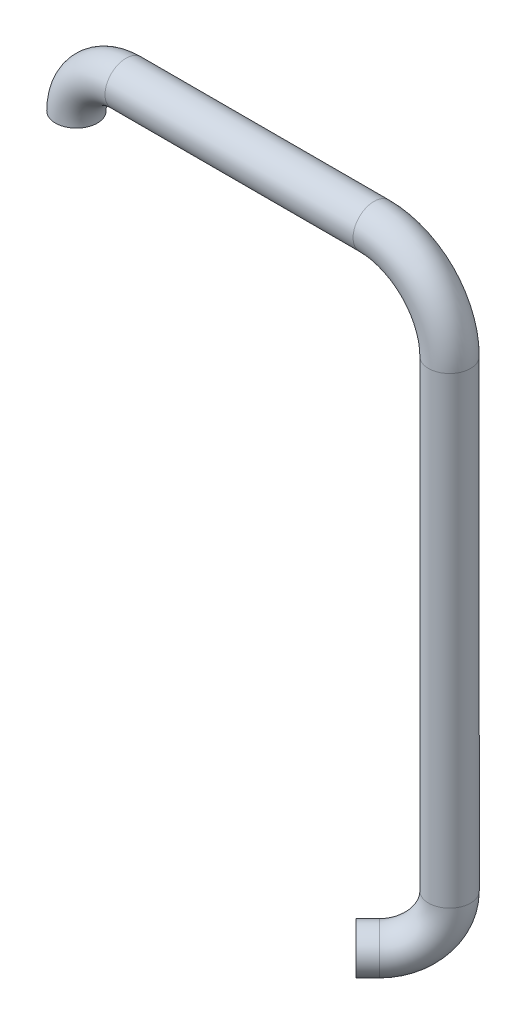
ISO-10303-21;
HEADER;
FILE_DESCRIPTION(('STEP AP214'),'2;1');
FILE_NAME('part.step','',(''),(''),'','','');
FILE_SCHEMA(('AUTOMOTIVE_DESIGN { 1 0 10303 214 1 1 1 1 }'));
ENDSEC;
DATA;
#1=APPLICATION_CONTEXT('core data for automotive mechanical design processes');
#2=APPLICATION_PROTOCOL_DEFINITION('international standard','automotive_design',2000,#1);
#3=PRODUCT_CONTEXT('',#1,'mechanical');
#4=PRODUCT('Part','Part','',(#3));
#5=PRODUCT_RELATED_PRODUCT_CATEGORY('part','',(#4));
#6=PRODUCT_DEFINITION_FORMATION('','',#4);
#7=PRODUCT_DEFINITION_CONTEXT('part definition',#1,'design');
#8=PRODUCT_DEFINITION('design','',#6,#7);
#9=PRODUCT_DEFINITION_SHAPE('','',#8);
#10=(LENGTH_UNIT() NAMED_UNIT(*) SI_UNIT(.MILLI.,.METRE.));
#11=(NAMED_UNIT(*) PLANE_ANGLE_UNIT() SI_UNIT($,.RADIAN.));
#12=(NAMED_UNIT(*) SI_UNIT($,.STERADIAN.) SOLID_ANGLE_UNIT());
#13=UNCERTAINTY_MEASURE_WITH_UNIT(LENGTH_MEASURE(1.E-05),#10,'distance_accuracy_value','');
#14=(GEOMETRIC_REPRESENTATION_CONTEXT(3) GLOBAL_UNCERTAINTY_ASSIGNED_CONTEXT((#13)) GLOBAL_UNIT_ASSIGNED_CONTEXT((#10,
#11,#12)) REPRESENTATION_CONTEXT('',''));
#15=CARTESIAN_POINT('',(0.,0.,0.));
#16=DIRECTION('',(0.,0.,1.));
#17=DIRECTION('',(1.,0.,0.));
#18=AXIS2_PLACEMENT_3D('',#15,#16,#17);
#19=CARTESIAN_POINT('',(175.213762880924,-340.00000000001,32.4817907597417));
#20=DIRECTION('',(-0.707106781186551,0.,0.707106781186544));
#21=DIRECTION('',(0.499999999999996,-0.707106781186551,0.5));
#22=AXIS2_PLACEMENT_3D('',#19,#20,#21);
#23=PLANE('',#22);
#24=CARTESIAN_POINT('',(175.213762880924,-340.00000000001,32.4817907597417));
#25=DIRECTION('',(-0.707106781186551,0.,0.707106781186544));
#26=DIRECTION('',(0.707106781186544,0.,0.707106781186551));
#27=AXIS2_PLACEMENT_3D('',#24,#25,#26);
#28=CIRCLE('',#27,9.7);
#29=CARTESIAN_POINT('',(182.072698658434,-340.00000000001,39.3407265372512));
#30=VERTEX_POINT('',#29);
#31=EDGE_CURVE('E91',#30,#30,#28,.T.);
#32=ORIENTED_EDGE('',*,*,#31,.F.);
#33=EDGE_LOOP('',(#32));
#34=FACE_BOUND('',#33,.T.);
#35=CARTESIAN_POINT('',(175.213762880924,-340.00000000001,32.4817907597417));
#36=DIRECTION('',(-0.707106781186551,0.,0.707106781186544));
#37=DIRECTION('',(0.499999999999996,-0.707106781186551,0.5));
#38=AXIS2_PLACEMENT_3D('',#35,#36,#37);
#39=CIRCLE('',#38,12.7);
#40=CARTESIAN_POINT('',(181.563762880924,-348.980256121079,38.8317907597417));
#41=VERTEX_POINT('',#40);
#42=EDGE_CURVE('E82',#41,#41,#39,.T.);
#43=ORIENTED_EDGE('',*,*,#42,.T.);
#44=EDGE_LOOP('',(#43));
#45=FACE_BOUND('',#44,.T.);
#46=ADVANCED_FACE('F51',(#34,#45),#23,.T.);
#47=CARTESIAN_POINT('',(-22.1673219572046,-14.3346439144093,4.19751951227996));
#48=DIRECTION('',(0.,1.,0.));
#49=DIRECTION('',(-1.,0.,0.));
#50=AXIS2_PLACEMENT_3D('',#47,#48,#49);
#51=PLANE('',#50);
#52=CARTESIAN_POINT('',(-22.1673219572046,-14.3346439144093,4.19751951227996));
#53=DIRECTION('',(0.,1.,0.));
#54=DIRECTION('',(-1.,0.,0.));
#55=AXIS2_PLACEMENT_3D('',#52,#53,#54);
#56=CIRCLE('',#55,9.7);
#57=CARTESIAN_POINT('',(-31.8673219572046,-14.3346439144093,4.19751951227996));
#58=VERTEX_POINT('',#57);
#59=EDGE_CURVE('E86',#58,#58,#56,.T.);
#60=ORIENTED_EDGE('',*,*,#59,.T.);
#61=EDGE_LOOP('',(#60));
#62=FACE_BOUND('',#61,.T.);
#63=CARTESIAN_POINT('',(-22.1673219572046,-14.3346439144093,4.19751951227996));
#64=DIRECTION('',(0.,1.,0.));
#65=DIRECTION('',(-1.,0.,0.));
#66=AXIS2_PLACEMENT_3D('',#63,#64,#65);
#67=CIRCLE('',#66,12.7);
#68=CARTESIAN_POINT('',(-34.8673219572046,-14.3346439144093,4.19751951227996));
#69=VERTEX_POINT('',#68);
#70=EDGE_CURVE('E11',#69,#69,#67,.T.);
#71=ORIENTED_EDGE('',*,*,#70,.F.);
#72=EDGE_LOOP('',(#71));
#73=FACE_BOUND('',#72,.T.);
#74=ADVANCED_FACE('F126',(#62,#73),#51,.F.);
#75=CARTESIAN_POINT('',(175.213762880924,-340.00000000001,32.4817907597417));
#76=DIRECTION('',(0.707106781186551,0.,-0.707106781186544));
#77=DIRECTION('',(-0.707106781186544,0.,-0.707106781186551));
#78=AXIS2_PLACEMENT_3D('',#75,#76,#77);
#79=CYLINDRICAL_SURFACE('',#78,12.7);
#80=CARTESIAN_POINT('',(182.28483069279,-340.00000000001,25.4107229478763));
#81=DIRECTION('',(-0.707106781186551,0.,0.707106781186544));
#82=DIRECTION('',(0.499999999999996,-0.707106781186551,0.5));
#83=AXIS2_PLACEMENT_3D('',#80,#81,#82);
#84=CIRCLE('',#83,12.7);
#85=CARTESIAN_POINT('',(182.28483069279,-352.70000000001,25.4107229478763));
#86=VERTEX_POINT('',#85);
#87=EDGE_CURVE('E78',#86,#86,#84,.T.);
#88=ORIENTED_EDGE('',*,*,#87,.T.);
#89=EDGE_LOOP('',(#88));
#90=FACE_BOUND('',#89,.T.);
#91=ORIENTED_EDGE('',*,*,#42,.F.);
#92=EDGE_LOOP('',(#91));
#93=FACE_BOUND('',#92,.T.);
#94=ADVANCED_FACE('F130',(#90,#93),#79,.T.);
#95=CARTESIAN_POINT('',(182.28483069279,-310.00000000001,25.4107229478763));
#96=DIRECTION('',(0.707106781186544,0.,0.707106781186551));
#97=DIRECTION('',(0.707106781186551,0.,-0.707106781186544));
#98=AXIS2_PLACEMENT_3D('',#95,#96,#97);
#99=TOROIDAL_SURFACE('',#98,30.,12.7);
#100=CARTESIAN_POINT('',(203.498034128386,-310.00000000001,4.19751951227995));
#101=DIRECTION('',(0.,-1.,0.));
#102=DIRECTION('',(1.,0.,0.));
#103=AXIS2_PLACEMENT_3D('',#100,#101,#102);
#104=CIRCLE('',#103,12.7);
#105=CARTESIAN_POINT('',(212.478290249455,-310.00000000001,-4.78273660878915));
#106=VERTEX_POINT('',#105);
#107=EDGE_CURVE('E74',#106,#106,#104,.T.);
#108=CARTESIAN_POINT('',(182.28483069279,-310.00000000001,25.4107229478763));
#109=DIRECTION('',(0.707106781186544,0.,0.707106781186551));
#110=DIRECTION('',(0.707106781186551,0.,-0.707106781186544));
#111=AXIS2_PLACEMENT_3D('',#108,#109,#110);
#112=CIRCLE('',#111,42.7);
#113=EDGE_CURVE('',#86,#106,#112,.T.);
#114=ORIENTED_EDGE('',*,*,#87,.F.);
#115=ORIENTED_EDGE('',*,*,#107,.T.);
#116=ORIENTED_EDGE('',*,*,#113,.T.);
#117=ORIENTED_EDGE('',*,*,#113,.F.);
#118=EDGE_LOOP('',(#114,#116,#115,#117));
#119=FACE_BOUND('',#118,.T.);
#120=ADVANCED_FACE('F132',(#119),#99,.T.);
#121=CARTESIAN_POINT('',(203.498034128386,-310.00000000001,4.19751951227992));
#122=DIRECTION('',(0.,1.,0.));
#123=DIRECTION('',(0.,0.,1.));
#124=AXIS2_PLACEMENT_3D('',#121,#122,#123);
#125=CYLINDRICAL_SURFACE('',#124,12.7);
#126=CARTESIAN_POINT('',(203.498034128386,-30.,4.19751951227995));
#127=DIRECTION('',(0.,-1.,0.));
#128=DIRECTION('',(1.,0.,0.));
#129=AXIS2_PLACEMENT_3D('',#126,#127,#128);
#130=CIRCLE('',#129,12.7);
#131=CARTESIAN_POINT('',(216.198034128386,-30.,4.19751951227995));
#132=VERTEX_POINT('',#131);
#133=EDGE_CURVE('E68',#132,#132,#130,.T.);
#134=ORIENTED_EDGE('',*,*,#133,.T.);
#135=EDGE_LOOP('',(#134));
#136=FACE_BOUND('',#135,.T.);
#137=ORIENTED_EDGE('',*,*,#107,.F.);
#138=EDGE_LOOP('',(#137));
#139=FACE_BOUND('',#138,.T.);
#140=ADVANCED_FACE('F139',(#136,#139),#125,.T.);
#141=CARTESIAN_POINT('',(157.832678042795,-30.,4.19751951227995));
#142=DIRECTION('',(0.,0.,1.));
#143=DIRECTION('',(0.,-1.,0.));
#144=AXIS2_PLACEMENT_3D('',#141,#142,#143);
#145=TOROIDAL_SURFACE('',#144,45.6653560855907,12.7);
#146=CARTESIAN_POINT('',(157.832678042795,15.6653560855907,4.19751951227996));
#147=DIRECTION('',(1.,0.,0.));
#148=DIRECTION('',(0.,1.,0.));
#149=AXIS2_PLACEMENT_3D('',#146,#147,#148);
#150=CIRCLE('',#149,12.7);
#151=CARTESIAN_POINT('',(157.832678042795,28.3653560855907,4.19751951227996));
#152=VERTEX_POINT('',#151);
#153=EDGE_CURVE('E63',#152,#152,#150,.T.);
#154=CARTESIAN_POINT('',(157.832678042795,-30.,4.19751951227995));
#155=DIRECTION('',(0.,0.,1.));
#156=DIRECTION('',(0.,-1.,0.));
#157=AXIS2_PLACEMENT_3D('',#154,#155,#156);
#158=CIRCLE('',#157,58.3653560855907);
#159=EDGE_CURVE('',#132,#152,#158,.T.);
#160=ORIENTED_EDGE('',*,*,#133,.F.);
#161=ORIENTED_EDGE('',*,*,#153,.T.);
#162=ORIENTED_EDGE('',*,*,#159,.T.);
#163=ORIENTED_EDGE('',*,*,#159,.F.);
#164=EDGE_LOOP('',(#160,#162,#161,#163));
#165=FACE_BOUND('',#164,.T.);
#166=ADVANCED_FACE('F150',(#165),#145,.T.);
#167=CARTESIAN_POINT('',(157.832678042795,15.6653560855907,4.19751951227996));
#168=DIRECTION('',(-1.,0.,0.));
#169=DIRECTION('',(0.,0.,1.));
#170=AXIS2_PLACEMENT_3D('',#167,#168,#169);
#171=CYLINDRICAL_SURFACE('',#170,12.7);
#172=CARTESIAN_POINT('',(7.83267804279536,15.6653560855907,4.19751951227996));
#173=DIRECTION('',(1.,0.,0.));
#174=DIRECTION('',(0.,1.,0.));
#175=AXIS2_PLACEMENT_3D('',#172,#173,#174);
#176=CIRCLE('',#175,12.7);
#177=CARTESIAN_POINT('',(7.83267804279536,28.3653560855907,4.19751951227996));
#178=VERTEX_POINT('',#177);
#179=EDGE_CURVE('E58',#178,#178,#176,.T.);
#180=ORIENTED_EDGE('',*,*,#179,.T.);
#181=EDGE_LOOP('',(#180));
#182=FACE_BOUND('',#181,.T.);
#183=ORIENTED_EDGE('',*,*,#153,.F.);
#184=EDGE_LOOP('',(#183));
#185=FACE_BOUND('',#184,.T.);
#186=ADVANCED_FACE('F145',(#182,#185),#171,.T.);
#187=CARTESIAN_POINT('',(7.83267804279536,-14.3346439144093,4.19751951227996));
#188=DIRECTION('',(0.,0.,1.));
#189=DIRECTION('',(1.,0.,0.));
#190=AXIS2_PLACEMENT_3D('',#187,#188,#189);
#191=TOROIDAL_SURFACE('',#190,30.,12.7);
#192=CARTESIAN_POINT('',(7.83267804279536,-14.3346439144093,4.19751951227996));
#193=DIRECTION('',(0.,0.,1.));
#194=DIRECTION('',(1.,0.,0.));
#195=AXIS2_PLACEMENT_3D('',#192,#193,#194);
#196=CIRCLE('',#195,42.7);
#197=EDGE_CURVE('',#178,#69,#196,.T.);
#198=ORIENTED_EDGE('',*,*,#179,.F.);
#199=ORIENTED_EDGE('',*,*,#70,.T.);
#200=ORIENTED_EDGE('',*,*,#197,.T.);
#201=ORIENTED_EDGE('',*,*,#197,.F.);
#202=EDGE_LOOP('',(#198,#200,#199,#201));
#203=FACE_BOUND('',#202,.T.);
#204=ADVANCED_FACE('F120',(#203),#191,.T.);
#205=CARTESIAN_POINT('',(175.213762880924,-340.00000000001,32.4817907597417));
#206=DIRECTION('',(0.707106781186551,0.,-0.707106781186544));
#207=DIRECTION('',(-0.707106781186544,0.,-0.707106781186551));
#208=AXIS2_PLACEMENT_3D('',#205,#206,#207);
#209=CYLINDRICAL_SURFACE('',#208,9.7);
#210=CARTESIAN_POINT('',(182.28483069279,-340.00000000001,25.4107229478763));
#211=DIRECTION('',(0.707106781186551,0.,-0.707106781186544));
#212=DIRECTION('',(-0.707106781186544,0.,-0.707106781186551));
#213=AXIS2_PLACEMENT_3D('',#210,#211,#212);
#214=CIRCLE('',#213,9.7);
#215=CARTESIAN_POINT('',(182.28483069279,-349.70000000001,25.4107229478763));
#216=VERTEX_POINT('',#215);
#217=EDGE_CURVE('E95',#216,#216,#214,.F.);
#218=ORIENTED_EDGE('',*,*,#217,.F.);
#219=EDGE_LOOP('',(#218));
#220=FACE_BOUND('',#219,.T.);
#221=ORIENTED_EDGE('',*,*,#31,.T.);
#222=EDGE_LOOP('',(#221));
#223=FACE_BOUND('',#222,.T.);
#224=ADVANCED_FACE('F117',(#220,#223),#209,.F.);
#225=CARTESIAN_POINT('',(182.28483069279,-310.00000000001,25.4107229478763));
#226=DIRECTION('',(0.707106781186544,0.,0.707106781186551));
#227=DIRECTION('',(0.707106781186551,0.,-0.707106781186544));
#228=AXIS2_PLACEMENT_3D('',#225,#226,#227);
#229=TOROIDAL_SURFACE('',#228,30.,9.7);
#230=CARTESIAN_POINT('',(203.498034128386,-310.00000000001,4.19751951227996));
#231=DIRECTION('',(0.,-1.,0.));
#232=DIRECTION('',(0.,0.,-1.));
#233=AXIS2_PLACEMENT_3D('',#230,#231,#232);
#234=CIRCLE('',#233,9.7);
#235=CARTESIAN_POINT('',(210.356969905896,-310.00000000001,-2.66141626522953));
#236=VERTEX_POINT('',#235);
#237=EDGE_CURVE('E107',#236,#236,#234,.T.);
#238=CARTESIAN_POINT('',(182.28483069279,-310.00000000001,25.4107229478763));
#239=DIRECTION('',(0.707106781186544,0.,0.707106781186551));
#240=DIRECTION('',(0.707106781186551,0.,-0.707106781186544));
#241=AXIS2_PLACEMENT_3D('',#238,#239,#240);
#242=CIRCLE('',#241,39.7);
#243=EDGE_CURVE('',#216,#236,#242,.T.);
#244=ORIENTED_EDGE('',*,*,#217,.T.);
#245=ORIENTED_EDGE('',*,*,#237,.F.);
#246=ORIENTED_EDGE('',*,*,#243,.T.);
#247=ORIENTED_EDGE('',*,*,#243,.F.);
#248=EDGE_LOOP('',(#244,#246,#245,#247));
#249=FACE_BOUND('',#248,.T.);
#250=ADVANCED_FACE('F115',(#249),#229,.F.);
#251=CARTESIAN_POINT('',(203.498034128386,-310.00000000001,4.19751951227992));
#252=DIRECTION('',(0.,1.,0.));
#253=DIRECTION('',(0.,0.,1.));
#254=AXIS2_PLACEMENT_3D('',#251,#252,#253);
#255=CYLINDRICAL_SURFACE('',#254,9.7);
#256=CARTESIAN_POINT('',(203.498034128386,-30.,4.19751951227995));
#257=DIRECTION('',(0.,1.,0.));
#258=DIRECTION('',(0.,0.,1.));
#259=AXIS2_PLACEMENT_3D('',#256,#257,#258);
#260=CIRCLE('',#259,9.7);
#261=CARTESIAN_POINT('',(213.198034128386,-30.,4.19751951227995));
#262=VERTEX_POINT('',#261);
#263=EDGE_CURVE('E103',#262,#262,#260,.F.);
#264=ORIENTED_EDGE('',*,*,#263,.F.);
#265=EDGE_LOOP('',(#264));
#266=FACE_BOUND('',#265,.T.);
#267=ORIENTED_EDGE('',*,*,#237,.T.);
#268=EDGE_LOOP('',(#267));
#269=FACE_BOUND('',#268,.T.);
#270=ADVANCED_FACE('F212',(#266,#269),#255,.F.);
#271=CARTESIAN_POINT('',(157.832678042795,-30.,4.19751951227995));
#272=DIRECTION('',(0.,0.,1.));
#273=DIRECTION('',(0.,-1.,0.));
#274=AXIS2_PLACEMENT_3D('',#271,#272,#273);
#275=TOROIDAL_SURFACE('',#274,45.6653560855907,9.7);
#276=CARTESIAN_POINT('',(157.832678042795,15.6653560855907,4.19751951227996));
#277=DIRECTION('',(1.,0.,0.));
#278=DIRECTION('',(0.,1.,0.));
#279=AXIS2_PLACEMENT_3D('',#276,#277,#278);
#280=CIRCLE('',#279,9.7);
#281=CARTESIAN_POINT('',(157.832678042795,25.3653560855907,4.19751951227996));
#282=VERTEX_POINT('',#281);
#283=EDGE_CURVE('E99',#282,#282,#280,.T.);
#284=CARTESIAN_POINT('',(157.832678042795,-30.,4.19751951227995));
#285=DIRECTION('',(0.,0.,1.));
#286=DIRECTION('',(0.,-1.,0.));
#287=AXIS2_PLACEMENT_3D('',#284,#285,#286);
#288=CIRCLE('',#287,55.3653560855907);
#289=EDGE_CURVE('',#262,#282,#288,.T.);
#290=ORIENTED_EDGE('',*,*,#263,.T.);
#291=ORIENTED_EDGE('',*,*,#283,.F.);
#292=ORIENTED_EDGE('',*,*,#289,.T.);
#293=ORIENTED_EDGE('',*,*,#289,.F.);
#294=EDGE_LOOP('',(#290,#292,#291,#293));
#295=FACE_BOUND('',#294,.T.);
#296=ADVANCED_FACE('F223',(#295),#275,.F.);
#297=CARTESIAN_POINT('',(157.832678042795,15.6653560855907,4.19751951227996));
#298=DIRECTION('',(-1.,0.,0.));
#299=DIRECTION('',(0.,0.,1.));
#300=AXIS2_PLACEMENT_3D('',#297,#298,#299);
#301=CYLINDRICAL_SURFACE('',#300,9.7);
#302=CARTESIAN_POINT('',(7.83267804279536,15.6653560855907,4.19751951227996));
#303=DIRECTION('',(-1.,0.,0.));
#304=DIRECTION('',(0.,0.,1.));
#305=AXIS2_PLACEMENT_3D('',#302,#303,#304);
#306=CIRCLE('',#305,9.7);
#307=CARTESIAN_POINT('',(7.83267804279536,25.3653560855907,4.19751951227996));
#308=VERTEX_POINT('',#307);
#309=EDGE_CURVE('E90',#308,#308,#306,.F.);
#310=ORIENTED_EDGE('',*,*,#309,.F.);
#311=EDGE_LOOP('',(#310));
#312=FACE_BOUND('',#311,.T.);
#313=ORIENTED_EDGE('',*,*,#283,.T.);
#314=EDGE_LOOP('',(#313));
#315=FACE_BOUND('',#314,.T.);
#316=ADVANCED_FACE('F234',(#312,#315),#301,.F.);
#317=CARTESIAN_POINT('',(7.83267804279536,-14.3346439144093,4.19751951227996));
#318=DIRECTION('',(0.,0.,1.));
#319=DIRECTION('',(1.,0.,0.));
#320=AXIS2_PLACEMENT_3D('',#317,#318,#319);
#321=TOROIDAL_SURFACE('',#320,30.,9.7);
#322=CARTESIAN_POINT('',(7.83267804279536,-14.3346439144093,4.19751951227996));
#323=DIRECTION('',(0.,0.,1.));
#324=DIRECTION('',(1.,0.,0.));
#325=AXIS2_PLACEMENT_3D('',#322,#323,#324);
#326=CIRCLE('',#325,39.7);
#327=EDGE_CURVE('',#308,#58,#326,.T.);
#328=ORIENTED_EDGE('',*,*,#309,.T.);
#329=ORIENTED_EDGE('',*,*,#59,.F.);
#330=ORIENTED_EDGE('',*,*,#327,.T.);
#331=ORIENTED_EDGE('',*,*,#327,.F.);
#332=EDGE_LOOP('',(#328,#330,#329,#331));
#333=FACE_BOUND('',#332,.T.);
#334=ADVANCED_FACE('F127',(#333),#321,.F.);
#335=CLOSED_SHELL('',(#46,#74,#94,#120,#140,#166,#186,#204,#224,#250,#270,#296,#316,#334));
#336=MANIFOLD_SOLID_BREP('B2',#335);
#337=ADVANCED_BREP_SHAPE_REPRESENTATION('',(#18,#336),#14);
#338=SHAPE_DEFINITION_REPRESENTATION(#9,#337);
ENDSEC;
END-ISO-10303-21;
